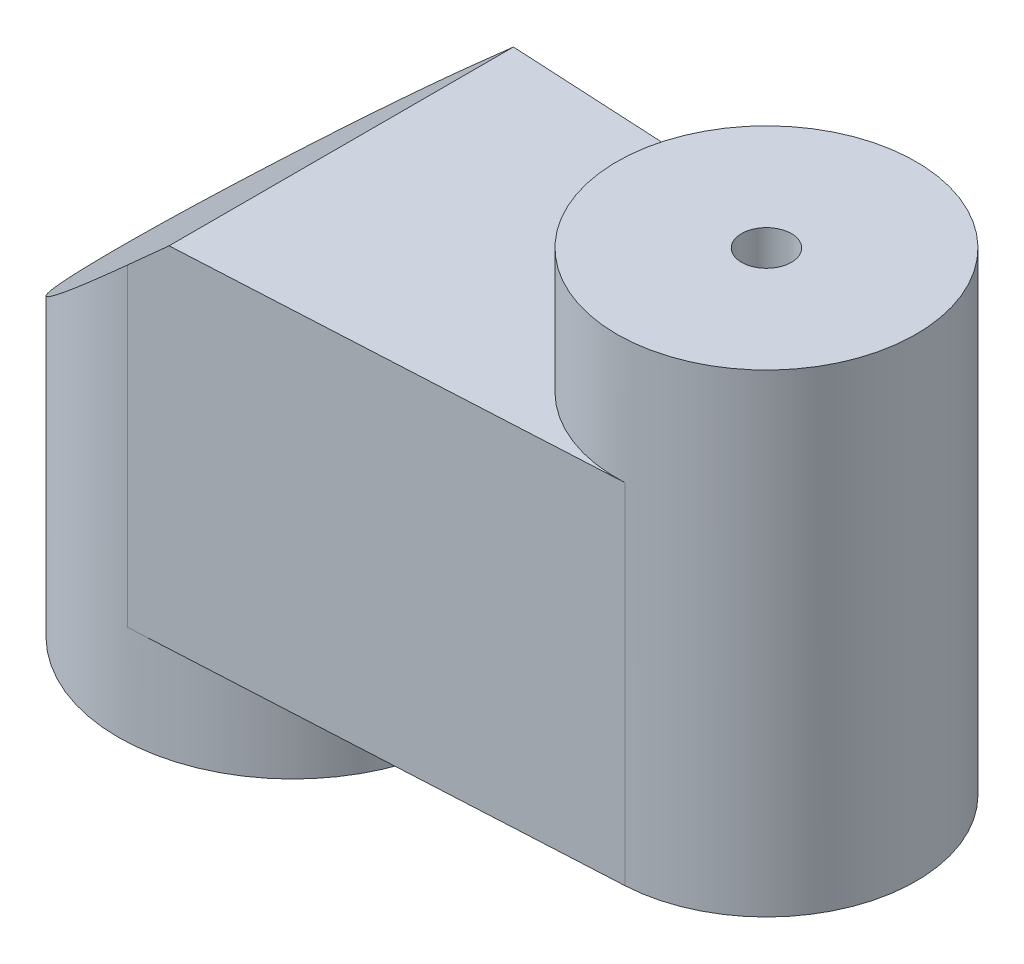
ISO-10303-21;
HEADER;
FILE_DESCRIPTION(('STEP AP214'),'2;1');
FILE_NAME('part.step','',(''),(''),'','','');
FILE_SCHEMA(('AUTOMOTIVE_DESIGN { 1 0 10303 214 1 1 1 1 }'));
ENDSEC;
DATA;
#1=APPLICATION_CONTEXT('core data for automotive mechanical design processes');
#2=APPLICATION_PROTOCOL_DEFINITION('international standard','automotive_design',2000,#1);
#3=PRODUCT_CONTEXT('',#1,'mechanical');
#4=PRODUCT('Part','Part','',(#3));
#5=PRODUCT_RELATED_PRODUCT_CATEGORY('part','',(#4));
#6=PRODUCT_DEFINITION_FORMATION('','',#4);
#7=PRODUCT_DEFINITION_CONTEXT('part definition',#1,'design');
#8=PRODUCT_DEFINITION('design','',#6,#7);
#9=PRODUCT_DEFINITION_SHAPE('','',#8);
#10=(LENGTH_UNIT() NAMED_UNIT(*) SI_UNIT(.MILLI.,.METRE.));
#11=(NAMED_UNIT(*) PLANE_ANGLE_UNIT() SI_UNIT($,.RADIAN.));
#12=(NAMED_UNIT(*) SI_UNIT($,.STERADIAN.) SOLID_ANGLE_UNIT());
#13=UNCERTAINTY_MEASURE_WITH_UNIT(LENGTH_MEASURE(1.E-05),#10,'distance_accuracy_value','');
#14=(GEOMETRIC_REPRESENTATION_CONTEXT(3) GLOBAL_UNCERTAINTY_ASSIGNED_CONTEXT((#13)) GLOBAL_UNIT_ASSIGNED_CONTEXT((#10,
#11,#12)) REPRESENTATION_CONTEXT('',''));
#15=CARTESIAN_POINT('',(0.,0.,0.));
#16=DIRECTION('',(0.,0.,1.));
#17=DIRECTION('',(1.,0.,0.));
#18=AXIS2_PLACEMENT_3D('',#15,#16,#17);
#19=CARTESIAN_POINT('',(0.,20.,0.));
#20=DIRECTION('',(0.,-1.,0.));
#21=DIRECTION('',(0.,0.,-1.));
#22=AXIS2_PLACEMENT_3D('',#19,#20,#21);
#23=CYLINDRICAL_SURFACE('',#22,35.);
#24=CARTESIAN_POINT('',(0.,81.3049516849971,0.));
#25=DIRECTION('',(0.666666666666667,-0.74535599249993,0.));
#26=DIRECTION('',(-0.74535599249993,-0.666666666666667,0.));
#27=AXIS2_PLACEMENT_3D('',#24,#25,#26);
#28=ELLIPSE('',#27,46.9574275274956,35.);
#29=CARTESIAN_POINT('',(1.8421052631579,82.9525807210496,34.9514899281768));
#30=VERTEX_POINT('',#29);
#31=CARTESIAN_POINT('',(1.8421052631579,82.9525807210496,-34.9514899281768));
#32=VERTEX_POINT('',#31);
#33=EDGE_CURVE('E95',#30,#32,#28,.T.);
#34=ORIENTED_EDGE('',*,*,#33,.T.);
#35=DIRECTION('',(0.,-1.,0.));
#36=VECTOR('',#35,1.);
#37=CARTESIAN_POINT('',(1.8421052631579,90.,-34.9514899281768));
#38=LINE('',#37,#36);
#39=CARTESIAN_POINT('',(1.8421052631579,20.,-34.9514899281768));
#40=VERTEX_POINT('',#39);
#41=EDGE_CURVE('E60',#32,#40,#38,.T.);
#42=ORIENTED_EDGE('',*,*,#41,.T.);
#43=CARTESIAN_POINT('',(0.,20.,0.));
#44=DIRECTION('',(0.,1.,0.));
#45=DIRECTION('',(0.,0.,1.));
#46=AXIS2_PLACEMENT_3D('',#43,#44,#45);
#47=CIRCLE('',#46,35.);
#48=CARTESIAN_POINT('',(1.8421052631579,20.,34.9514899281768));
#49=VERTEX_POINT('',#48);
#50=EDGE_CURVE('E122',#49,#40,#47,.T.);
#51=ORIENTED_EDGE('',*,*,#50,.F.);
#52=DIRECTION('',(0.,-1.,0.));
#53=VECTOR('',#52,1.);
#54=CARTESIAN_POINT('',(1.8421052631579,90.,34.9514899281768));
#55=LINE('',#54,#53);
#56=EDGE_CURVE('E119',#30,#49,#55,.T.);
#57=ORIENTED_EDGE('',*,*,#56,.F.);
#58=EDGE_LOOP('',(#34,#42,#51,#57));
#59=FACE_BOUND('',#58,.T.);
#60=CARTESIAN_POINT('',(0.,0.,0.));
#61=DIRECTION('',(0.,1.,0.));
#62=DIRECTION('',(0.,0.,1.));
#63=AXIS2_PLACEMENT_3D('',#60,#61,#62);
#64=CIRCLE('',#63,35.);
#65=CARTESIAN_POINT('',(0.,0.,35.));
#66=VERTEX_POINT('',#65);
#67=EDGE_CURVE('E121',#66,#66,#64,.T.);
#68=ORIENTED_EDGE('',*,*,#67,.T.);
#69=EDGE_LOOP('',(#68));
#70=FACE_BOUND('',#69,.T.);
#71=ADVANCED_FACE('F39',(#59,#70),#23,.T.);
#72=CARTESIAN_POINT('',(0.,0.,0.));
#73=DIRECTION('',(0.,1.,0.));
#74=DIRECTION('',(0.,0.,1.));
#75=AXIS2_PLACEMENT_3D('',#72,#73,#74);
#76=PLANE('',#75);
#77=ORIENTED_EDGE('',*,*,#67,.F.);
#78=EDGE_LOOP('',(#77));
#79=FACE_BOUND('',#78,.T.);
#80=ADVANCED_FACE('F127',(#79),#76,.F.);
#81=CARTESIAN_POINT('',(0.,20.,0.));
#82=DIRECTION('',(0.,1.,0.));
#83=DIRECTION('',(0.,0.,1.));
#84=AXIS2_PLACEMENT_3D('',#81,#82,#83);
#85=PLANE('',#84);
#86=CARTESIAN_POINT('',(95.,20.,0.));
#87=DIRECTION('',(0.,1.,0.));
#88=DIRECTION('',(0.,0.,1.));
#89=AXIS2_PLACEMENT_3D('',#86,#87,#88);
#90=CIRCLE('',#89,5.);
#91=CARTESIAN_POINT('',(95.,20.,5.));
#92=VERTEX_POINT('',#91);
#93=EDGE_CURVE('E96',#92,#92,#90,.T.);
#94=ORIENTED_EDGE('',*,*,#93,.T.);
#95=EDGE_LOOP('',(#94));
#96=FACE_BOUND('',#95,.T.);
#97=DIRECTION('',(0.998613997947909,0.,-0.0526315789473686));
#98=VECTOR('',#97,1.);
#99=CARTESIAN_POINT('',(1.8421052631579,20.,34.9514899281768));
#100=LINE('',#99,#98);
#101=CARTESIAN_POINT('',(96.5789473684211,20.,29.9584199384373));
#102=VERTEX_POINT('',#101);
#103=EDGE_CURVE('E109',#49,#102,#100,.T.);
#104=ORIENTED_EDGE('',*,*,#103,.F.);
#105=ORIENTED_EDGE('',*,*,#50,.T.);
#106=DIRECTION('',(-0.998613997947909,0.,-0.0526315789473685));
#107=VECTOR('',#106,1.);
#108=CARTESIAN_POINT('',(1.8421052631579,20.,-34.9514899281768));
#109=LINE('',#108,#107);
#110=CARTESIAN_POINT('',(96.5789473684211,20.,-29.9584199384373));
#111=VERTEX_POINT('',#110);
#112=EDGE_CURVE('E105',#111,#40,#109,.T.);
#113=ORIENTED_EDGE('',*,*,#112,.F.);
#114=CARTESIAN_POINT('',(95.,20.,0.));
#115=DIRECTION('',(0.,1.,0.));
#116=DIRECTION('',(0.,0.,1.));
#117=AXIS2_PLACEMENT_3D('',#114,#115,#116);
#118=CIRCLE('',#117,30.);
#119=EDGE_CURVE('E111',#102,#111,#118,.T.);
#120=ORIENTED_EDGE('',*,*,#119,.F.);
#121=EDGE_LOOP('',(#104,#105,#113,#120));
#122=FACE_BOUND('',#121,.T.);
#123=ADVANCED_FACE('F129',(#96,#122),#85,.F.);
#124=CARTESIAN_POINT('',(1.8421052631579,90.,34.9514899281768));
#125=DIRECTION('',(-0.0526315789473686,0.,-0.998613997947909));
#126=DIRECTION('',(-0.998613997947909,0.,0.0526315789473686));
#127=AXIS2_PLACEMENT_3D('',#124,#125,#126);
#128=PLANE('',#127);
#129=DIRECTION('',(0.998613997947909,0.,-0.0526315789473686));
#130=VECTOR('',#129,1.);
#131=CARTESIAN_POINT('',(1.8421052631579,90.,34.9514899281768));
#132=LINE('',#131,#130);
#133=CARTESIAN_POINT('',(9.72135954999578,90.,34.536216764676));
#134=VERTEX_POINT('',#133);
#135=CARTESIAN_POINT('',(96.5789473684211,90.,29.9584199384373));
#136=VERTEX_POINT('',#135);
#137=EDGE_CURVE('E101',#134,#136,#132,.T.);
#138=ORIENTED_EDGE('',*,*,#137,.F.);
#139=DIRECTION('',(-0.744781536929041,-0.666152857984043,0.0392534335989431));
#140=VECTOR('',#139,1.);
#141=CARTESIAN_POINT('',(5.33860023173927,86.0799408941431,34.7672084627096));
#142=LINE('',#141,#140);
#143=EDGE_CURVE('E52',#134,#30,#142,.T.);
#144=ORIENTED_EDGE('',*,*,#143,.T.);
#145=ORIENTED_EDGE('',*,*,#56,.T.);
#146=ORIENTED_EDGE('',*,*,#103,.T.);
#147=DIRECTION('',(0.,-1.,0.));
#148=VECTOR('',#147,1.);
#149=CARTESIAN_POINT('',(96.5789473684211,90.,29.9584199384373));
#150=LINE('',#149,#148);
#151=EDGE_CURVE('E116',#136,#102,#150,.T.);
#152=ORIENTED_EDGE('',*,*,#151,.F.);
#153=EDGE_LOOP('',(#138,#144,#145,#146,#152));
#154=FACE_BOUND('',#153,.T.);
#155=ADVANCED_FACE('F134',(#154),#128,.F.);
#156=CARTESIAN_POINT('',(95.,90.,0.));
#157=DIRECTION('',(0.,-1.,0.));
#158=DIRECTION('',(0.,0.,-1.));
#159=AXIS2_PLACEMENT_3D('',#156,#157,#158);
#160=CYLINDRICAL_SURFACE('',#159,30.);
#161=ORIENTED_EDGE('',*,*,#119,.T.);
#162=DIRECTION('',(0.,-1.,0.));
#163=VECTOR('',#162,1.);
#164=CARTESIAN_POINT('',(96.5789473684211,90.,-29.9584199384373));
#165=LINE('',#164,#163);
#166=CARTESIAN_POINT('',(96.5789473684211,90.,-29.9584199384373));
#167=VERTEX_POINT('',#166);
#168=EDGE_CURVE('E103',#167,#111,#165,.T.);
#169=ORIENTED_EDGE('',*,*,#168,.F.);
#170=CARTESIAN_POINT('',(95.,90.,0.));
#171=DIRECTION('',(0.,1.,0.));
#172=DIRECTION('',(0.,0.,1.));
#173=AXIS2_PLACEMENT_3D('',#170,#171,#172);
#174=CIRCLE('',#173,30.);
#175=EDGE_CURVE('E46',#167,#136,#174,.T.);
#176=ORIENTED_EDGE('',*,*,#175,.T.);
#177=ORIENTED_EDGE('',*,*,#151,.T.);
#178=EDGE_LOOP('',(#161,#169,#176,#177));
#179=FACE_BOUND('',#178,.T.);
#180=CARTESIAN_POINT('',(95.,115.,0.));
#181=DIRECTION('',(0.,1.,0.));
#182=DIRECTION('',(0.,0.,1.));
#183=AXIS2_PLACEMENT_3D('',#180,#181,#182);
#184=CIRCLE('',#183,30.);
#185=CARTESIAN_POINT('',(95.,115.,30.));
#186=VERTEX_POINT('',#185);
#187=EDGE_CURVE('E112',#186,#186,#184,.T.);
#188=ORIENTED_EDGE('',*,*,#187,.F.);
#189=EDGE_LOOP('',(#188));
#190=FACE_BOUND('',#189,.T.);
#191=ADVANCED_FACE('F141',(#179,#190),#160,.T.);
#192=CARTESIAN_POINT('',(1.8421052631579,90.,-34.9514899281768));
#193=DIRECTION('',(-0.0526315789473685,0.,0.998613997947909));
#194=DIRECTION('',(0.998613997947909,0.,0.0526315789473685));
#195=AXIS2_PLACEMENT_3D('',#192,#193,#194);
#196=PLANE('',#195);
#197=ORIENTED_EDGE('',*,*,#41,.F.);
#198=DIRECTION('',(0.744781536929041,0.666152857984043,0.039253433598943));
#199=VECTOR('',#198,1.);
#200=CARTESIAN_POINT('',(5.33860023173927,86.0799408941431,-34.7672084627096));
#201=LINE('',#200,#199);
#202=CARTESIAN_POINT('',(9.72135954999578,90.,-34.5362167646759));
#203=VERTEX_POINT('',#202);
#204=EDGE_CURVE('E85',#32,#203,#201,.T.);
#205=ORIENTED_EDGE('',*,*,#204,.T.);
#206=DIRECTION('',(-0.998613997947909,0.,-0.0526315789473685));
#207=VECTOR('',#206,1.);
#208=CARTESIAN_POINT('',(1.8421052631579,90.,-34.9514899281768));
#209=LINE('',#208,#207);
#210=EDGE_CURVE('E93',#167,#203,#209,.T.);
#211=ORIENTED_EDGE('',*,*,#210,.F.);
#212=ORIENTED_EDGE('',*,*,#168,.T.);
#213=ORIENTED_EDGE('',*,*,#112,.T.);
#214=EDGE_LOOP('',(#197,#205,#211,#212,#213));
#215=FACE_BOUND('',#214,.T.);
#216=ADVANCED_FACE('F91',(#215),#196,.F.);
#217=CARTESIAN_POINT('',(0.,90.,0.));
#218=DIRECTION('',(0.,1.,0.));
#219=DIRECTION('',(0.,0.,1.));
#220=AXIS2_PLACEMENT_3D('',#217,#218,#219);
#221=PLANE('',#220);
#222=DIRECTION('',(0.,0.,-1.));
#223=VECTOR('',#222,1.);
#224=CARTESIAN_POINT('',(9.72135954999578,90.,0.));
#225=LINE('',#224,#223);
#226=EDGE_CURVE('E11',#134,#203,#225,.T.);
#227=ORIENTED_EDGE('',*,*,#226,.F.);
#228=ORIENTED_EDGE('',*,*,#137,.T.);
#229=ORIENTED_EDGE('',*,*,#175,.F.);
#230=ORIENTED_EDGE('',*,*,#210,.T.);
#231=EDGE_LOOP('',(#227,#228,#229,#230));
#232=FACE_BOUND('',#231,.T.);
#233=ADVANCED_FACE('F98',(#232),#221,.T.);
#234=CARTESIAN_POINT('',(95.,115.,0.));
#235=DIRECTION('',(0.,1.,0.));
#236=DIRECTION('',(0.,0.,1.));
#237=AXIS2_PLACEMENT_3D('',#234,#235,#236);
#238=PLANE('',#237);
#239=CARTESIAN_POINT('',(95.,115.,0.));
#240=DIRECTION('',(0.,1.,0.));
#241=DIRECTION('',(0.,0.,1.));
#242=AXIS2_PLACEMENT_3D('',#239,#240,#241);
#243=CIRCLE('',#242,5.);
#244=CARTESIAN_POINT('',(95.,115.,5.));
#245=VERTEX_POINT('',#244);
#246=EDGE_CURVE('E163',#245,#245,#243,.T.);
#247=ORIENTED_EDGE('',*,*,#246,.F.);
#248=EDGE_LOOP('',(#247));
#249=FACE_BOUND('',#248,.T.);
#250=ORIENTED_EDGE('',*,*,#187,.T.);
#251=EDGE_LOOP('',(#250));
#252=FACE_BOUND('',#251,.T.);
#253=ADVANCED_FACE('F149',(#249,#252),#238,.T.);
#254=CARTESIAN_POINT('',(9.72135954999578,90.,-44.));
#255=DIRECTION('',(0.666666666666667,-0.74535599249993,0.));
#256=DIRECTION('',(0.74535599249993,0.666666666666667,0.));
#257=AXIS2_PLACEMENT_3D('',#254,#255,#256);
#258=PLANE('',#257);
#259=ORIENTED_EDGE('',*,*,#226,.T.);
#260=ORIENTED_EDGE('',*,*,#204,.F.);
#261=ORIENTED_EDGE('',*,*,#33,.F.);
#262=ORIENTED_EDGE('',*,*,#143,.F.);
#263=EDGE_LOOP('',(#259,#260,#261,#262));
#264=FACE_BOUND('',#263,.T.);
#265=ADVANCED_FACE('F84',(#264),#258,.F.);
#266=CARTESIAN_POINT('',(95.,0.,0.));
#267=DIRECTION('',(0.,1.,0.));
#268=DIRECTION('',(0.,0.,1.));
#269=AXIS2_PLACEMENT_3D('',#266,#267,#268);
#270=CYLINDRICAL_SURFACE('',#269,5.);
#271=CARTESIAN_POINT('',(95.,115.,5.));
#272=CARTESIAN_POINT('',(95.,114.010416666667,5.));
#273=CARTESIAN_POINT('',(95.,113.020833333333,5.));
#274=CARTESIAN_POINT('',(95.,111.041666666667,5.));
#275=CARTESIAN_POINT('',(95.,110.052083333333,5.));
#276=CARTESIAN_POINT('',(95.,108.072916666667,5.));
#277=CARTESIAN_POINT('',(95.,107.083333333333,5.));
#278=CARTESIAN_POINT('',(95.,105.104166666667,5.));
#279=CARTESIAN_POINT('',(95.,104.114583333333,5.));
#280=CARTESIAN_POINT('',(95.,102.135416666667,5.));
#281=CARTESIAN_POINT('',(95.,101.145833333333,5.));
#282=CARTESIAN_POINT('',(95.,99.1666666666667,5.));
#283=CARTESIAN_POINT('',(95.,98.1770833333333,5.));
#284=CARTESIAN_POINT('',(95.,96.1979166666667,5.));
#285=CARTESIAN_POINT('',(95.,95.2083333333333,5.));
#286=CARTESIAN_POINT('',(95.,93.2291666666667,5.));
#287=CARTESIAN_POINT('',(95.,92.2395833333333,5.));
#288=CARTESIAN_POINT('',(95.,90.2604166666667,5.));
#289=CARTESIAN_POINT('',(95.,89.2708333333333,5.));
#290=CARTESIAN_POINT('',(95.,87.2916666666667,5.));
#291=CARTESIAN_POINT('',(95.,86.3020833333333,5.));
#292=CARTESIAN_POINT('',(95.,84.3229166666667,5.));
#293=CARTESIAN_POINT('',(95.,83.3333333333333,5.));
#294=CARTESIAN_POINT('',(95.,81.3541666666667,5.));
#295=CARTESIAN_POINT('',(95.,80.3645833333333,5.));
#296=CARTESIAN_POINT('',(95.,78.3854166666667,5.));
#297=CARTESIAN_POINT('',(95.,77.3958333333333,5.));
#298=CARTESIAN_POINT('',(95.,75.4166666666667,5.));
#299=CARTESIAN_POINT('',(95.,74.4270833333333,5.));
#300=CARTESIAN_POINT('',(95.,72.4479166666667,5.));
#301=CARTESIAN_POINT('',(95.,71.4583333333333,5.));
#302=CARTESIAN_POINT('',(95.,69.4791666666667,5.));
#303=CARTESIAN_POINT('',(95.,68.4895833333333,5.));
#304=CARTESIAN_POINT('',(95.,66.5104166666667,5.));
#305=CARTESIAN_POINT('',(95.,65.5208333333333,5.));
#306=CARTESIAN_POINT('',(95.,63.5416666666667,5.));
#307=CARTESIAN_POINT('',(95.,62.5520833333333,5.));
#308=CARTESIAN_POINT('',(95.,60.5729166666667,5.));
#309=CARTESIAN_POINT('',(95.,59.5833333333333,5.));
#310=CARTESIAN_POINT('',(95.,57.6041666666667,5.));
#311=CARTESIAN_POINT('',(95.,56.6145833333333,5.));
#312=CARTESIAN_POINT('',(95.,54.6354166666667,5.));
#313=CARTESIAN_POINT('',(95.,53.6458333333333,5.));
#314=CARTESIAN_POINT('',(95.,51.6666666666667,5.));
#315=CARTESIAN_POINT('',(95.,50.6770833333333,5.));
#316=CARTESIAN_POINT('',(95.,48.6979166666667,5.));
#317=CARTESIAN_POINT('',(95.,47.7083333333333,5.));
#318=CARTESIAN_POINT('',(95.,45.7291666666667,5.));
#319=CARTESIAN_POINT('',(95.,44.7395833333333,5.));
#320=CARTESIAN_POINT('',(95.,42.7604166666667,5.));
#321=CARTESIAN_POINT('',(95.,41.7708333333333,5.));
#322=CARTESIAN_POINT('',(95.,39.7916666666667,5.));
#323=CARTESIAN_POINT('',(95.,38.8020833333333,5.));
#324=CARTESIAN_POINT('',(95.,36.8229166666667,5.));
#325=CARTESIAN_POINT('',(95.,35.8333333333333,5.));
#326=CARTESIAN_POINT('',(95.,33.8541666666667,5.));
#327=CARTESIAN_POINT('',(95.,32.8645833333333,5.));
#328=CARTESIAN_POINT('',(95.,30.8854166666667,5.));
#329=CARTESIAN_POINT('',(95.,29.8958333333333,5.));
#330=CARTESIAN_POINT('',(95.,27.9166666666667,5.));
#331=CARTESIAN_POINT('',(95.,26.9270833333333,5.));
#332=CARTESIAN_POINT('',(95.,24.9479166666667,5.));
#333=CARTESIAN_POINT('',(95.,23.9583333333333,5.));
#334=CARTESIAN_POINT('',(95.,21.9791666666667,5.));
#335=CARTESIAN_POINT('',(95.,20.9895833333333,5.));
#336=CARTESIAN_POINT('',(95.,20.,5.));
#337=B_SPLINE_CURVE_WITH_KNOTS('',3,(#271,#272,#273,#274,#275,#276,#277,#278,#279,#280,#281,
#282,#283,#284,#285,#286,#287,#288,#289,#290,#291,#292,#293,#294,#295,#296,#297,#298,#299,#300,
#301,#302,#303,#304,#305,#306,#307,#308,#309,#310,#311,#312,#313,#314,#315,#316,#317,#318,#319,
#320,#321,#322,#323,#324,#325,#326,#327,#328,#329,#330,#331,#332,#333,#334,#335,#336),
.UNSPECIFIED.,.F.,.F.,(4,2,2,2,2,2,2,2,2,2,2,2,2,2,2,2,2,2,2,2,2,2,2,2,2,2,2,2,2,2,2,2,4),(0.,
2.96875000000001,5.9375,8.90625,11.875,14.84375,17.8125,20.78125,23.75,26.71875,29.6875,
32.65625,35.625,38.59375,41.5625,44.53125,47.5,50.46875,53.4375,56.40625,59.375,62.34375,
65.3125,68.28125,71.25,74.21875,77.1875,80.15625,83.125,86.09375,89.0625,92.03125,95.),.UNSPECIFIED.);
#338=EDGE_CURVE('BSEAM155',#245,#92,#337,.T.);
#339=ORIENTED_EDGE('',*,*,#246,.T.);
#340=ORIENTED_EDGE('',*,*,#93,.F.);
#341=ORIENTED_EDGE('',*,*,#338,.T.);
#342=ORIENTED_EDGE('',*,*,#338,.F.);
#343=EDGE_LOOP('',(#339,#341,#340,#342));
#344=FACE_BOUND('',#343,.T.);
#345=ADVANCED_FACE('F155',(#344),#270,.F.);
#346=CLOSED_SHELL('',(#71,#80,#123,#155,#191,#216,#233,#253,#265,#345));
#347=MANIFOLD_SOLID_BREP('B2',#346);
#348=ADVANCED_BREP_SHAPE_REPRESENTATION('',(#18,#347),#14);
#349=SHAPE_DEFINITION_REPRESENTATION(#9,#348);
ENDSEC;
END-ISO-10303-21;
